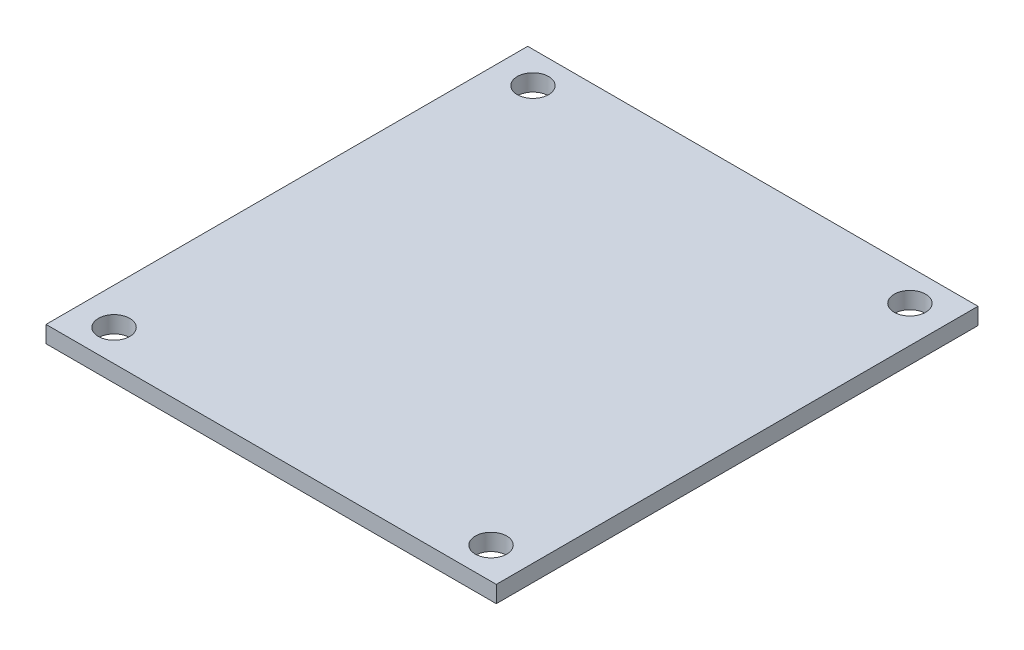
ISO-10303-21;
HEADER;
FILE_DESCRIPTION(('STEP AP214'),'2;1');
FILE_NAME('part.step','',(''),(''),'','','');
FILE_SCHEMA(('AUTOMOTIVE_DESIGN { 1 0 10303 214 1 1 1 1 }'));
ENDSEC;
DATA;
#1=APPLICATION_CONTEXT('core data for automotive mechanical design processes');
#2=APPLICATION_PROTOCOL_DEFINITION('international standard','automotive_design',2000,#1);
#3=PRODUCT_CONTEXT('',#1,'mechanical');
#4=PRODUCT('Part','Part','',(#3));
#5=PRODUCT_RELATED_PRODUCT_CATEGORY('part','',(#4));
#6=PRODUCT_DEFINITION_FORMATION('','',#4);
#7=PRODUCT_DEFINITION_CONTEXT('part definition',#1,'design');
#8=PRODUCT_DEFINITION('design','',#6,#7);
#9=PRODUCT_DEFINITION_SHAPE('','',#8);
#10=(LENGTH_UNIT() NAMED_UNIT(*) SI_UNIT(.MILLI.,.METRE.));
#11=(NAMED_UNIT(*) PLANE_ANGLE_UNIT() SI_UNIT($,.RADIAN.));
#12=(NAMED_UNIT(*) SI_UNIT($,.STERADIAN.) SOLID_ANGLE_UNIT());
#13=UNCERTAINTY_MEASURE_WITH_UNIT(LENGTH_MEASURE(1.E-05),#10,'distance_accuracy_value','');
#14=(GEOMETRIC_REPRESENTATION_CONTEXT(3) GLOBAL_UNCERTAINTY_ASSIGNED_CONTEXT((#13)) GLOBAL_UNIT_ASSIGNED_CONTEXT((#10,
#11,#12)) REPRESENTATION_CONTEXT('',''));
#15=CARTESIAN_POINT('',(0.,0.,0.));
#16=DIRECTION('',(0.,0.,1.));
#17=DIRECTION('',(1.,0.,0.));
#18=AXIS2_PLACEMENT_3D('',#15,#16,#17);
#19=CARTESIAN_POINT('',(0.,1.6,0.));
#20=DIRECTION('',(0.,1.,0.));
#21=DIRECTION('',(0.,0.,1.));
#22=AXIS2_PLACEMENT_3D('',#19,#20,#21);
#23=PLANE('',#22);
#24=CARTESIAN_POINT('',(18.,1.6,20.));
#25=DIRECTION('',(0.,1.,0.));
#26=DIRECTION('',(0.,0.,1.));
#27=AXIS2_PLACEMENT_3D('',#24,#25,#26);
#28=CIRCLE('',#27,1.5);
#29=CARTESIAN_POINT('',(18.,1.6,21.5));
#30=VERTEX_POINT('',#29);
#31=EDGE_CURVE('E121',#30,#30,#28,.T.);
#32=ORIENTED_EDGE('',*,*,#31,.F.);
#33=EDGE_LOOP('',(#32));
#34=FACE_BOUND('',#33,.T.);
#35=CARTESIAN_POINT('',(-18.,1.6,-20.));
#36=DIRECTION('',(0.,1.,0.));
#37=DIRECTION('',(0.,0.,1.));
#38=AXIS2_PLACEMENT_3D('',#35,#36,#37);
#39=CIRCLE('',#38,1.5);
#40=CARTESIAN_POINT('',(-18.,1.6,-18.5));
#41=VERTEX_POINT('',#40);
#42=EDGE_CURVE('E100',#41,#41,#39,.T.);
#43=ORIENTED_EDGE('',*,*,#42,.F.);
#44=EDGE_LOOP('',(#43));
#45=FACE_BOUND('',#44,.T.);
#46=DIRECTION('',(0.,0.,-1.));
#47=VECTOR('',#46,1.);
#48=CARTESIAN_POINT('',(21.5,1.6,-23.));
#49=LINE('',#48,#47);
#50=CARTESIAN_POINT('',(21.5,1.6,23.));
#51=VERTEX_POINT('',#50);
#52=CARTESIAN_POINT('',(21.5,1.6,-23.));
#53=VERTEX_POINT('',#52);
#54=EDGE_CURVE('E85',#51,#53,#49,.T.);
#55=ORIENTED_EDGE('',*,*,#54,.T.);
#56=DIRECTION('',(-1.,0.,0.));
#57=VECTOR('',#56,1.);
#58=CARTESIAN_POINT('',(-21.5,1.6,-23.));
#59=LINE('',#58,#57);
#60=CARTESIAN_POINT('',(-21.5,1.6,-23.));
#61=VERTEX_POINT('',#60);
#62=EDGE_CURVE('E80',#53,#61,#59,.T.);
#63=ORIENTED_EDGE('',*,*,#62,.T.);
#64=DIRECTION('',(0.,0.,1.));
#65=VECTOR('',#64,1.);
#66=CARTESIAN_POINT('',(-21.5,1.6,-23.));
#67=LINE('',#66,#65);
#68=CARTESIAN_POINT('',(-21.5,1.6,23.));
#69=VERTEX_POINT('',#68);
#70=EDGE_CURVE('E83',#61,#69,#67,.T.);
#71=ORIENTED_EDGE('',*,*,#70,.T.);
#72=DIRECTION('',(1.,0.,0.));
#73=VECTOR('',#72,1.);
#74=CARTESIAN_POINT('',(-21.5,1.6,23.));
#75=LINE('',#74,#73);
#76=EDGE_CURVE('E50',#69,#51,#75,.T.);
#77=ORIENTED_EDGE('',*,*,#76,.T.);
#78=EDGE_LOOP('',(#55,#63,#71,#77));
#79=FACE_BOUND('',#78,.T.);
#80=CARTESIAN_POINT('',(18.,1.6,-20.));
#81=DIRECTION('',(0.,1.,0.));
#82=DIRECTION('',(0.,0.,1.));
#83=AXIS2_PLACEMENT_3D('',#80,#81,#82);
#84=CIRCLE('',#83,1.5);
#85=CARTESIAN_POINT('',(18.,1.6,-18.5));
#86=VERTEX_POINT('',#85);
#87=EDGE_CURVE('E115',#86,#86,#84,.T.);
#88=ORIENTED_EDGE('',*,*,#87,.F.);
#89=EDGE_LOOP('',(#88));
#90=FACE_BOUND('',#89,.T.);
#91=CARTESIAN_POINT('',(-18.,1.6,20.));
#92=DIRECTION('',(0.,1.,0.));
#93=DIRECTION('',(0.,0.,1.));
#94=AXIS2_PLACEMENT_3D('',#91,#92,#93);
#95=CIRCLE('',#94,1.5);
#96=CARTESIAN_POINT('',(-18.,1.6,21.5));
#97=VERTEX_POINT('',#96);
#98=EDGE_CURVE('E127',#97,#97,#95,.T.);
#99=ORIENTED_EDGE('',*,*,#98,.F.);
#100=EDGE_LOOP('',(#99));
#101=FACE_BOUND('',#100,.T.);
#102=ADVANCED_FACE('F33',(#34,#45,#79,#90,#101),#23,.T.);
#103=CARTESIAN_POINT('',(0.,0.,0.));
#104=DIRECTION('',(0.,1.,0.));
#105=DIRECTION('',(0.,0.,1.));
#106=AXIS2_PLACEMENT_3D('',#103,#104,#105);
#107=PLANE('',#106);
#108=CARTESIAN_POINT('',(18.,0.,20.));
#109=DIRECTION('',(0.,1.,0.));
#110=DIRECTION('',(0.,0.,1.));
#111=AXIS2_PLACEMENT_3D('',#108,#109,#110);
#112=CIRCLE('',#111,1.5);
#113=CARTESIAN_POINT('',(18.,0.,21.5));
#114=VERTEX_POINT('',#113);
#115=EDGE_CURVE('E124',#114,#114,#112,.T.);
#116=ORIENTED_EDGE('',*,*,#115,.T.);
#117=EDGE_LOOP('',(#116));
#118=FACE_BOUND('',#117,.T.);
#119=CARTESIAN_POINT('',(-18.,0.,-20.));
#120=DIRECTION('',(0.,1.,0.));
#121=DIRECTION('',(0.,0.,1.));
#122=AXIS2_PLACEMENT_3D('',#119,#120,#121);
#123=CIRCLE('',#122,1.5);
#124=CARTESIAN_POINT('',(-18.,0.,-18.5));
#125=VERTEX_POINT('',#124);
#126=EDGE_CURVE('E112',#125,#125,#123,.T.);
#127=ORIENTED_EDGE('',*,*,#126,.T.);
#128=EDGE_LOOP('',(#127));
#129=FACE_BOUND('',#128,.T.);
#130=DIRECTION('',(0.,0.,-1.));
#131=VECTOR('',#130,1.);
#132=CARTESIAN_POINT('',(21.5,0.,-23.));
#133=LINE('',#132,#131);
#134=CARTESIAN_POINT('',(21.5,0.,23.));
#135=VERTEX_POINT('',#134);
#136=CARTESIAN_POINT('',(21.5,0.,-23.));
#137=VERTEX_POINT('',#136);
#138=EDGE_CURVE('E97',#135,#137,#133,.T.);
#139=ORIENTED_EDGE('',*,*,#138,.F.);
#140=DIRECTION('',(1.,0.,0.));
#141=VECTOR('',#140,1.);
#142=CARTESIAN_POINT('',(-21.5,0.,23.));
#143=LINE('',#142,#141);
#144=CARTESIAN_POINT('',(-21.5,0.,23.));
#145=VERTEX_POINT('',#144);
#146=EDGE_CURVE('E73',#145,#135,#143,.T.);
#147=ORIENTED_EDGE('',*,*,#146,.F.);
#148=DIRECTION('',(0.,0.,1.));
#149=VECTOR('',#148,1.);
#150=CARTESIAN_POINT('',(-21.5,0.,-23.));
#151=LINE('',#150,#149);
#152=CARTESIAN_POINT('',(-21.5,0.,-23.));
#153=VERTEX_POINT('',#152);
#154=EDGE_CURVE('E67',#153,#145,#151,.T.);
#155=ORIENTED_EDGE('',*,*,#154,.F.);
#156=DIRECTION('',(-1.,0.,0.));
#157=VECTOR('',#156,1.);
#158=CARTESIAN_POINT('',(-21.5,0.,-23.));
#159=LINE('',#158,#157);
#160=EDGE_CURVE('E89',#137,#153,#159,.T.);
#161=ORIENTED_EDGE('',*,*,#160,.F.);
#162=EDGE_LOOP('',(#139,#147,#155,#161));
#163=FACE_BOUND('',#162,.T.);
#164=CARTESIAN_POINT('',(18.,0.,-20.));
#165=DIRECTION('',(0.,1.,0.));
#166=DIRECTION('',(0.,0.,1.));
#167=AXIS2_PLACEMENT_3D('',#164,#165,#166);
#168=CIRCLE('',#167,1.5);
#169=CARTESIAN_POINT('',(18.,0.,-18.5));
#170=VERTEX_POINT('',#169);
#171=EDGE_CURVE('E118',#170,#170,#168,.T.);
#172=ORIENTED_EDGE('',*,*,#171,.T.);
#173=EDGE_LOOP('',(#172));
#174=FACE_BOUND('',#173,.T.);
#175=CARTESIAN_POINT('',(-18.,0.,20.));
#176=DIRECTION('',(0.,1.,0.));
#177=DIRECTION('',(0.,0.,1.));
#178=AXIS2_PLACEMENT_3D('',#175,#176,#177);
#179=CIRCLE('',#178,1.5);
#180=CARTESIAN_POINT('',(-18.,0.,21.5));
#181=VERTEX_POINT('',#180);
#182=EDGE_CURVE('E130',#181,#181,#179,.T.);
#183=ORIENTED_EDGE('',*,*,#182,.T.);
#184=EDGE_LOOP('',(#183));
#185=FACE_BOUND('',#184,.T.);
#186=ADVANCED_FACE('F108',(#118,#129,#163,#174,#185),#107,.F.);
#187=CARTESIAN_POINT('',(21.5,1.6,-23.));
#188=DIRECTION('',(-1.,0.,0.));
#189=DIRECTION('',(0.,0.,1.));
#190=AXIS2_PLACEMENT_3D('',#187,#188,#189);
#191=PLANE('',#190);
#192=ORIENTED_EDGE('',*,*,#138,.T.);
#193=DIRECTION('',(0.,-1.,0.));
#194=VECTOR('',#193,1.);
#195=CARTESIAN_POINT('',(21.5,1.6,-23.));
#196=LINE('',#195,#194);
#197=EDGE_CURVE('E11',#53,#137,#196,.T.);
#198=ORIENTED_EDGE('',*,*,#197,.F.);
#199=ORIENTED_EDGE('',*,*,#54,.F.);
#200=DIRECTION('',(0.,-1.,0.));
#201=VECTOR('',#200,1.);
#202=CARTESIAN_POINT('',(21.5,1.6,23.));
#203=LINE('',#202,#201);
#204=EDGE_CURVE('E93',#51,#135,#203,.T.);
#205=ORIENTED_EDGE('',*,*,#204,.T.);
#206=EDGE_LOOP('',(#192,#198,#199,#205));
#207=FACE_BOUND('',#206,.T.);
#208=ADVANCED_FACE('F35',(#207),#191,.F.);
#209=CARTESIAN_POINT('',(-21.5,1.6,-23.));
#210=DIRECTION('',(0.,0.,1.));
#211=DIRECTION('',(1.,0.,0.));
#212=AXIS2_PLACEMENT_3D('',#209,#210,#211);
#213=PLANE('',#212);
#214=ORIENTED_EDGE('',*,*,#160,.T.);
#215=DIRECTION('',(0.,-1.,0.));
#216=VECTOR('',#215,1.);
#217=CARTESIAN_POINT('',(-21.5,1.6,-23.));
#218=LINE('',#217,#216);
#219=EDGE_CURVE('E42',#61,#153,#218,.T.);
#220=ORIENTED_EDGE('',*,*,#219,.F.);
#221=ORIENTED_EDGE('',*,*,#62,.F.);
#222=ORIENTED_EDGE('',*,*,#197,.T.);
#223=EDGE_LOOP('',(#214,#220,#221,#222));
#224=FACE_BOUND('',#223,.T.);
#225=ADVANCED_FACE('F88',(#224),#213,.F.);
#226=CARTESIAN_POINT('',(-21.5,1.6,-23.));
#227=DIRECTION('',(1.,0.,0.));
#228=DIRECTION('',(0.,0.,-1.));
#229=AXIS2_PLACEMENT_3D('',#226,#227,#228);
#230=PLANE('',#229);
#231=ORIENTED_EDGE('',*,*,#154,.T.);
#232=DIRECTION('',(0.,-1.,0.));
#233=VECTOR('',#232,1.);
#234=CARTESIAN_POINT('',(-21.5,1.6,23.));
#235=LINE('',#234,#233);
#236=EDGE_CURVE('E90',#69,#145,#235,.T.);
#237=ORIENTED_EDGE('',*,*,#236,.F.);
#238=ORIENTED_EDGE('',*,*,#70,.F.);
#239=ORIENTED_EDGE('',*,*,#219,.T.);
#240=EDGE_LOOP('',(#231,#237,#238,#239));
#241=FACE_BOUND('',#240,.T.);
#242=ADVANCED_FACE('F91',(#241),#230,.F.);
#243=CARTESIAN_POINT('',(-21.5,1.6,23.));
#244=DIRECTION('',(0.,0.,-1.));
#245=DIRECTION('',(-1.,0.,0.));
#246=AXIS2_PLACEMENT_3D('',#243,#244,#245);
#247=PLANE('',#246);
#248=ORIENTED_EDGE('',*,*,#146,.T.);
#249=ORIENTED_EDGE('',*,*,#204,.F.);
#250=ORIENTED_EDGE('',*,*,#76,.F.);
#251=ORIENTED_EDGE('',*,*,#236,.T.);
#252=EDGE_LOOP('',(#248,#249,#250,#251));
#253=FACE_BOUND('',#252,.T.);
#254=ADVANCED_FACE('F105',(#253),#247,.F.);
#255=CARTESIAN_POINT('',(-18.,1.6,-20.));
#256=DIRECTION('',(0.,-1.,0.));
#257=DIRECTION('',(0.,0.,-1.));
#258=AXIS2_PLACEMENT_3D('',#255,#256,#257);
#259=CYLINDRICAL_SURFACE('',#258,1.5);
#260=ORIENTED_EDGE('',*,*,#42,.T.);
#261=EDGE_LOOP('',(#260));
#262=FACE_BOUND('',#261,.T.);
#263=ORIENTED_EDGE('',*,*,#126,.F.);
#264=EDGE_LOOP('',(#263));
#265=FACE_BOUND('',#264,.T.);
#266=ADVANCED_FACE('F150',(#262,#265),#259,.F.);
#267=CARTESIAN_POINT('',(18.,1.6,-20.));
#268=DIRECTION('',(0.,-1.,0.));
#269=DIRECTION('',(0.,0.,-1.));
#270=AXIS2_PLACEMENT_3D('',#267,#268,#269);
#271=CYLINDRICAL_SURFACE('',#270,1.5);
#272=ORIENTED_EDGE('',*,*,#87,.T.);
#273=EDGE_LOOP('',(#272));
#274=FACE_BOUND('',#273,.T.);
#275=ORIENTED_EDGE('',*,*,#171,.F.);
#276=EDGE_LOOP('',(#275));
#277=FACE_BOUND('',#276,.T.);
#278=ADVANCED_FACE('F196',(#274,#277),#271,.F.);
#279=CARTESIAN_POINT('',(18.,1.6,20.));
#280=DIRECTION('',(0.,-1.,0.));
#281=DIRECTION('',(0.,0.,-1.));
#282=AXIS2_PLACEMENT_3D('',#279,#280,#281);
#283=CYLINDRICAL_SURFACE('',#282,1.5);
#284=ORIENTED_EDGE('',*,*,#31,.T.);
#285=EDGE_LOOP('',(#284));
#286=FACE_BOUND('',#285,.T.);
#287=ORIENTED_EDGE('',*,*,#115,.F.);
#288=EDGE_LOOP('',(#287));
#289=FACE_BOUND('',#288,.T.);
#290=ADVANCED_FACE('F204',(#286,#289),#283,.F.);
#291=CARTESIAN_POINT('',(-18.,1.6,20.));
#292=DIRECTION('',(0.,-1.,0.));
#293=DIRECTION('',(0.,0.,-1.));
#294=AXIS2_PLACEMENT_3D('',#291,#292,#293);
#295=CYLINDRICAL_SURFACE('',#294,1.5);
#296=ORIENTED_EDGE('',*,*,#98,.T.);
#297=EDGE_LOOP('',(#296));
#298=FACE_BOUND('',#297,.T.);
#299=ORIENTED_EDGE('',*,*,#182,.F.);
#300=EDGE_LOOP('',(#299));
#301=FACE_BOUND('',#300,.T.);
#302=ADVANCED_FACE('F136',(#298,#301),#295,.F.);
#303=CLOSED_SHELL('',(#102,#186,#208,#225,#242,#254,#266,#278,#290,#302));
#304=MANIFOLD_SOLID_BREP('B2',#303);
#305=ADVANCED_BREP_SHAPE_REPRESENTATION('',(#18,#304),#14);
#306=SHAPE_DEFINITION_REPRESENTATION(#9,#305);
ENDSEC;
END-ISO-10303-21;
